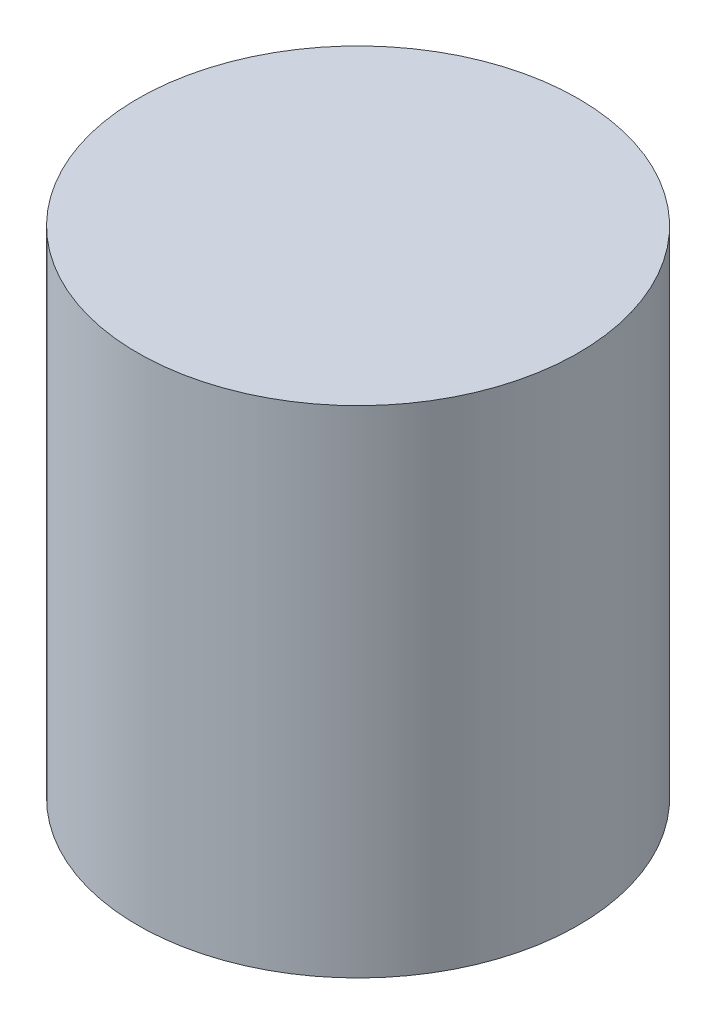
ISO-10303-21;
HEADER;
FILE_DESCRIPTION(('STEP AP214'),'2;1');
FILE_NAME('part.step','',(''),(''),'','','');
FILE_SCHEMA(('AUTOMOTIVE_DESIGN { 1 0 10303 214 1 1 1 1 }'));
ENDSEC;
DATA;
#1=APPLICATION_CONTEXT('core data for automotive mechanical design processes');
#2=APPLICATION_PROTOCOL_DEFINITION('international standard','automotive_design',2000,#1);
#3=PRODUCT_CONTEXT('',#1,'mechanical');
#4=PRODUCT('Part','Part','',(#3));
#5=PRODUCT_RELATED_PRODUCT_CATEGORY('part','',(#4));
#6=PRODUCT_DEFINITION_FORMATION('','',#4);
#7=PRODUCT_DEFINITION_CONTEXT('part definition',#1,'design');
#8=PRODUCT_DEFINITION('design','',#6,#7);
#9=PRODUCT_DEFINITION_SHAPE('','',#8);
#10=(LENGTH_UNIT() NAMED_UNIT(*) SI_UNIT(.MILLI.,.METRE.));
#11=(NAMED_UNIT(*) PLANE_ANGLE_UNIT() SI_UNIT($,.RADIAN.));
#12=(NAMED_UNIT(*) SI_UNIT($,.STERADIAN.) SOLID_ANGLE_UNIT());
#13=UNCERTAINTY_MEASURE_WITH_UNIT(LENGTH_MEASURE(1.E-05),#10,'distance_accuracy_value','');
#14=(GEOMETRIC_REPRESENTATION_CONTEXT(3) GLOBAL_UNCERTAINTY_ASSIGNED_CONTEXT((#13)) GLOBAL_UNIT_ASSIGNED_CONTEXT((#10,
#11,#12)) REPRESENTATION_CONTEXT('',''));
#15=CARTESIAN_POINT('',(0.,0.,0.));
#16=DIRECTION('',(0.,0.,1.));
#17=DIRECTION('',(1.,0.,0.));
#18=AXIS2_PLACEMENT_3D('',#15,#16,#17);
#19=CARTESIAN_POINT('',(0.,22.5,0.));
#20=DIRECTION('',(0.,-1.,0.));
#21=DIRECTION('',(0.,0.,-1.));
#22=AXIS2_PLACEMENT_3D('',#19,#20,#21);
#23=CYLINDRICAL_SURFACE('',#22,20.);
#24=CARTESIAN_POINT('',(0.,22.5,0.));
#25=DIRECTION('',(0.,1.,0.));
#26=DIRECTION('',(0.,0.,1.));
#27=AXIS2_PLACEMENT_3D('',#24,#25,#26);
#28=CIRCLE('',#27,20.);
#29=CARTESIAN_POINT('',(0.,22.5,-20.));
#30=VERTEX_POINT('',#29);
#31=EDGE_CURVE('E10',#30,#30,#28,.T.);
#32=CARTESIAN_POINT('',(0.,-22.5,0.));
#33=DIRECTION('',(0.,1.,0.));
#34=DIRECTION('',(0.,0.,1.));
#35=AXIS2_PLACEMENT_3D('',#32,#33,#34);
#36=CIRCLE('',#35,20.);
#37=CARTESIAN_POINT('',(0.,-22.5,-20.));
#38=VERTEX_POINT('',#37);
#39=EDGE_CURVE('E42',#38,#38,#36,.T.);
#40=CARTESIAN_POINT('',(0.,22.5,-20.));
#41=CARTESIAN_POINT('',(0.,22.03125,-20.));
#42=CARTESIAN_POINT('',(0.,21.5625,-20.));
#43=CARTESIAN_POINT('',(0.,20.625,-20.));
#44=CARTESIAN_POINT('',(0.,20.15625,-20.));
#45=CARTESIAN_POINT('',(0.,19.21875,-20.));
#46=CARTESIAN_POINT('',(0.,18.75,-20.));
#47=CARTESIAN_POINT('',(0.,17.8125,-20.));
#48=CARTESIAN_POINT('',(0.,17.34375,-20.));
#49=CARTESIAN_POINT('',(0.,16.40625,-20.));
#50=CARTESIAN_POINT('',(0.,15.9375,-20.));
#51=CARTESIAN_POINT('',(0.,15.,-20.));
#52=CARTESIAN_POINT('',(0.,14.53125,-20.));
#53=CARTESIAN_POINT('',(0.,13.59375,-20.));
#54=CARTESIAN_POINT('',(0.,13.125,-20.));
#55=CARTESIAN_POINT('',(0.,12.1875,-20.));
#56=CARTESIAN_POINT('',(0.,11.71875,-20.));
#57=CARTESIAN_POINT('',(0.,10.78125,-20.));
#58=CARTESIAN_POINT('',(0.,10.3125,-20.));
#59=CARTESIAN_POINT('',(0.,9.37499999999999,-20.));
#60=CARTESIAN_POINT('',(0.,8.90625,-20.));
#61=CARTESIAN_POINT('',(0.,7.96874999999999,-20.));
#62=CARTESIAN_POINT('',(0.,7.5,-20.));
#63=CARTESIAN_POINT('',(0.,6.5625,-20.));
#64=CARTESIAN_POINT('',(0.,6.09375,-20.));
#65=CARTESIAN_POINT('',(0.,5.15625,-20.));
#66=CARTESIAN_POINT('',(0.,4.6875,-20.));
#67=CARTESIAN_POINT('',(0.,3.75,-20.));
#68=CARTESIAN_POINT('',(0.,3.28125,-20.));
#69=CARTESIAN_POINT('',(0.,2.34375,-20.));
#70=CARTESIAN_POINT('',(0.,1.875,-20.));
#71=CARTESIAN_POINT('',(0.,0.937499999999997,-20.));
#72=CARTESIAN_POINT('',(0.,0.468749999999997,-20.));
#73=CARTESIAN_POINT('',(0.,-0.468750000000004,-20.));
#74=CARTESIAN_POINT('',(0.,-0.937500000000004,-20.));
#75=CARTESIAN_POINT('',(0.,-1.87500000000001,-20.));
#76=CARTESIAN_POINT('',(0.,-2.34375000000001,-20.));
#77=CARTESIAN_POINT('',(0.,-3.28125,-20.));
#78=CARTESIAN_POINT('',(0.,-3.75,-20.));
#79=CARTESIAN_POINT('',(0.,-4.6875,-20.));
#80=CARTESIAN_POINT('',(0.,-5.15625,-20.));
#81=CARTESIAN_POINT('',(0.,-6.09375000000001,-20.));
#82=CARTESIAN_POINT('',(0.,-6.56250000000001,-20.));
#83=CARTESIAN_POINT('',(0.,-7.50000000000001,-20.));
#84=CARTESIAN_POINT('',(0.,-7.96875000000001,-20.));
#85=CARTESIAN_POINT('',(0.,-8.90625,-20.));
#86=CARTESIAN_POINT('',(0.,-9.37500000000001,-20.));
#87=CARTESIAN_POINT('',(0.,-10.3125,-20.));
#88=CARTESIAN_POINT('',(0.,-10.78125,-20.));
#89=CARTESIAN_POINT('',(0.,-11.71875,-20.));
#90=CARTESIAN_POINT('',(0.,-12.1875,-20.));
#91=CARTESIAN_POINT('',(0.,-13.125,-20.));
#92=CARTESIAN_POINT('',(0.,-13.59375,-20.));
#93=CARTESIAN_POINT('',(0.,-14.53125,-20.));
#94=CARTESIAN_POINT('',(0.,-15.,-20.));
#95=CARTESIAN_POINT('',(0.,-15.9375,-20.));
#96=CARTESIAN_POINT('',(0.,-16.40625,-20.));
#97=CARTESIAN_POINT('',(0.,-17.34375,-20.));
#98=CARTESIAN_POINT('',(0.,-17.8125,-20.));
#99=CARTESIAN_POINT('',(0.,-18.75,-20.));
#100=CARTESIAN_POINT('',(0.,-19.21875,-20.));
#101=CARTESIAN_POINT('',(0.,-20.15625,-20.));
#102=CARTESIAN_POINT('',(0.,-20.625,-20.));
#103=CARTESIAN_POINT('',(0.,-21.5625,-20.));
#104=CARTESIAN_POINT('',(0.,-22.03125,-20.));
#105=CARTESIAN_POINT('',(0.,-22.5,-20.));
#106=B_SPLINE_CURVE_WITH_KNOTS('',3,(#40,#41,#42,#43,#44,#45,#46,#47,#48,#49,#50,#51,#52,#53,
#54,#55,#56,#57,#58,#59,#60,#61,#62,#63,#64,#65,#66,#67,#68,#69,#70,#71,#72,#73,#74,#75,#76,#77,
#78,#79,#80,#81,#82,#83,#84,#85,#86,#87,#88,#89,#90,#91,#92,#93,#94,#95,#96,#97,#98,#99,#100,
#101,#102,#103,#104,#105),.UNSPECIFIED.,.F.,.F.,(4,2,2,2,2,2,2,2,2,2,2,2,2,2,2,2,2,2,2,2,2,2,2,
2,2,2,2,2,2,2,2,2,4),(0.,1.40625,2.8125,4.21875,5.625,7.03125,8.4375,9.84375,11.25,12.65625,
14.0625,15.46875,16.875,18.28125,19.6875,21.09375,22.5,23.90625,25.3125,26.71875,28.125,
29.53125,30.9375,32.34375,33.75,35.15625,36.5625,37.96875,39.375,40.78125,42.1875,43.59375,45.),.UNSPECIFIED.);
#107=EDGE_CURVE('BSEAM39',#30,#38,#106,.T.);
#108=ORIENTED_EDGE('',*,*,#31,.F.);
#109=ORIENTED_EDGE('',*,*,#39,.T.);
#110=ORIENTED_EDGE('',*,*,#107,.T.);
#111=ORIENTED_EDGE('',*,*,#107,.F.);
#112=EDGE_LOOP('',(#108,#110,#109,#111));
#113=FACE_BOUND('',#112,.T.);
#114=ADVANCED_FACE('F39',(#113),#23,.T.);
#115=CARTESIAN_POINT('',(0.,22.5,0.));
#116=DIRECTION('',(0.,1.,0.));
#117=DIRECTION('',(0.,0.,1.));
#118=AXIS2_PLACEMENT_3D('',#115,#116,#117);
#119=PLANE('',#118);
#120=ORIENTED_EDGE('',*,*,#31,.T.);
#121=EDGE_LOOP('',(#120));
#122=FACE_BOUND('',#121,.T.);
#123=ADVANCED_FACE('F54',(#122),#119,.T.);
#124=CARTESIAN_POINT('',(0.,-22.5,0.));
#125=DIRECTION('',(0.,1.,0.));
#126=DIRECTION('',(0.,0.,1.));
#127=AXIS2_PLACEMENT_3D('',#124,#125,#126);
#128=PLANE('',#127);
#129=ORIENTED_EDGE('',*,*,#39,.F.);
#130=EDGE_LOOP('',(#129));
#131=FACE_BOUND('',#130,.T.);
#132=ADVANCED_FACE('F52',(#131),#128,.F.);
#133=CLOSED_SHELL('',(#114,#123,#132));
#134=MANIFOLD_SOLID_BREP('B2',#133);
#135=ADVANCED_BREP_SHAPE_REPRESENTATION('',(#18,#134),#14);
#136=SHAPE_DEFINITION_REPRESENTATION(#9,#135);
ENDSEC;
END-ISO-10303-21;
